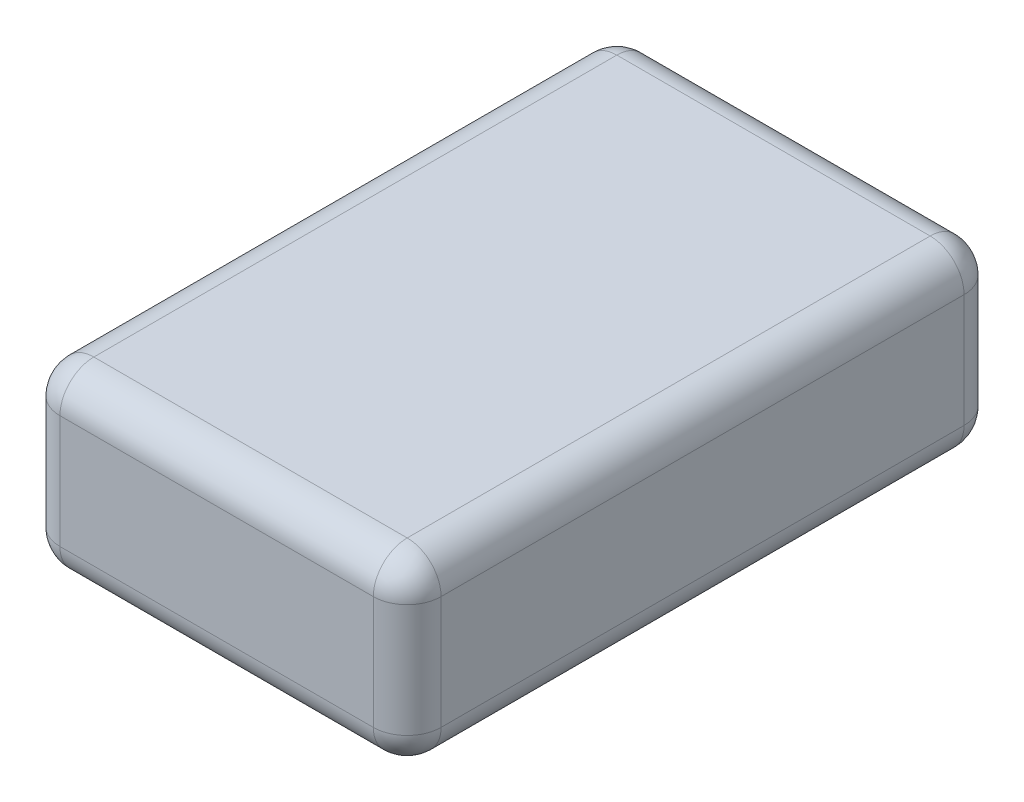
ISO-10303-21;
HEADER;
FILE_DESCRIPTION(('STEP AP214'),'2;1');
FILE_NAME('part.step','',(''),(''),'','','');
FILE_SCHEMA(('AUTOMOTIVE_DESIGN { 1 0 10303 214 1 1 1 1 }'));
ENDSEC;
DATA;
#1=APPLICATION_CONTEXT('core data for automotive mechanical design processes');
#2=APPLICATION_PROTOCOL_DEFINITION('international standard','automotive_design',2000,#1);
#3=PRODUCT_CONTEXT('',#1,'mechanical');
#4=PRODUCT('Part','Part','',(#3));
#5=PRODUCT_RELATED_PRODUCT_CATEGORY('part','',(#4));
#6=PRODUCT_DEFINITION_FORMATION('','',#4);
#7=PRODUCT_DEFINITION_CONTEXT('part definition',#1,'design');
#8=PRODUCT_DEFINITION('design','',#6,#7);
#9=PRODUCT_DEFINITION_SHAPE('','',#8);
#10=(LENGTH_UNIT() NAMED_UNIT(*) SI_UNIT(.MILLI.,.METRE.));
#11=(NAMED_UNIT(*) PLANE_ANGLE_UNIT() SI_UNIT($,.RADIAN.));
#12=(NAMED_UNIT(*) SI_UNIT($,.STERADIAN.) SOLID_ANGLE_UNIT());
#13=UNCERTAINTY_MEASURE_WITH_UNIT(LENGTH_MEASURE(1.E-05),#10,'distance_accuracy_value','');
#14=(GEOMETRIC_REPRESENTATION_CONTEXT(3) GLOBAL_UNCERTAINTY_ASSIGNED_CONTEXT((#13)) GLOBAL_UNIT_ASSIGNED_CONTEXT((#10,
#11,#12)) REPRESENTATION_CONTEXT('',''));
#15=CARTESIAN_POINT('',(0.,0.,0.));
#16=DIRECTION('',(0.,0.,1.));
#17=DIRECTION('',(1.,0.,0.));
#18=AXIS2_PLACEMENT_3D('',#15,#16,#17);
#19=CARTESIAN_POINT('',(10.,4.75,-15.499999988));
#20=DIRECTION('',(-1.,0.,0.));
#21=DIRECTION('',(0.,0.,1.));
#22=AXIS2_PLACEMENT_3D('',#19,#20,#21);
#23=PLANE('',#22);
#24=DIRECTION('',(0.,0.,-1.));
#25=VECTOR('',#24,1.);
#26=CARTESIAN_POINT('',(10.,2.972,15.499999988));
#27=LINE('',#26,#25);
#28=CARTESIAN_POINT('',(10.,2.972,-13.721999988));
#29=VERTEX_POINT('',#28);
#30=CARTESIAN_POINT('',(10.,2.972,13.721999988));
#31=VERTEX_POINT('',#30);
#32=EDGE_CURVE('E201',#29,#31,#27,.F.);
#33=ORIENTED_EDGE('',*,*,#32,.T.);
#34=DIRECTION('',(0.,-1.,0.));
#35=VECTOR('',#34,1.);
#36=CARTESIAN_POINT('',(10.,4.75,13.721999988));
#37=LINE('',#36,#35);
#38=CARTESIAN_POINT('',(10.,-2.972,13.721999988));
#39=VERTEX_POINT('',#38);
#40=EDGE_CURVE('E204',#31,#39,#37,.T.);
#41=ORIENTED_EDGE('',*,*,#40,.T.);
#42=DIRECTION('',(0.,0.,-1.));
#43=VECTOR('',#42,1.);
#44=CARTESIAN_POINT('',(10.,-2.972,-15.499999988));
#45=LINE('',#44,#43);
#46=CARTESIAN_POINT('',(10.,-2.972,-13.721999988));
#47=VERTEX_POINT('',#46);
#48=EDGE_CURVE('E195',#39,#47,#45,.T.);
#49=ORIENTED_EDGE('',*,*,#48,.T.);
#50=DIRECTION('',(0.,-1.,0.));
#51=VECTOR('',#50,1.);
#52=CARTESIAN_POINT('',(10.,4.75,-13.721999988));
#53=LINE('',#52,#51);
#54=EDGE_CURVE('E198',#47,#29,#53,.F.);
#55=ORIENTED_EDGE('',*,*,#54,.T.);
#56=EDGE_LOOP('',(#33,#41,#49,#55));
#57=FACE_BOUND('',#56,.T.);
#58=ADVANCED_FACE('F39',(#57),#23,.F.);
#59=CARTESIAN_POINT('',(-9.99999999999999,4.75,-15.499999988));
#60=DIRECTION('',(0.,0.,1.));
#61=DIRECTION('',(1.,0.,0.));
#62=AXIS2_PLACEMENT_3D('',#59,#60,#61);
#63=PLANE('',#62);
#64=DIRECTION('',(-1.,0.,0.));
#65=VECTOR('',#64,1.);
#66=CARTESIAN_POINT('',(10.,2.972,-15.499999988));
#67=LINE('',#66,#65);
#68=CARTESIAN_POINT('',(-8.22199999999999,2.972,-15.499999988));
#69=VERTEX_POINT('',#68);
#70=CARTESIAN_POINT('',(8.22200000000001,2.972,-15.499999988));
#71=VERTEX_POINT('',#70);
#72=EDGE_CURVE('E214',#69,#71,#67,.F.);
#73=ORIENTED_EDGE('',*,*,#72,.T.);
#74=DIRECTION('',(0.,-1.,0.));
#75=VECTOR('',#74,1.);
#76=CARTESIAN_POINT('',(8.22200000000001,4.75,-15.499999988));
#77=LINE('',#76,#75);
#78=CARTESIAN_POINT('',(8.22200000000001,-2.972,-15.499999988));
#79=VERTEX_POINT('',#78);
#80=EDGE_CURVE('E217',#71,#79,#77,.T.);
#81=ORIENTED_EDGE('',*,*,#80,.T.);
#82=DIRECTION('',(-1.,0.,0.));
#83=VECTOR('',#82,1.);
#84=CARTESIAN_POINT('',(-9.99999999999999,-2.972,-15.499999988));
#85=LINE('',#84,#83);
#86=CARTESIAN_POINT('',(-8.22199999999999,-2.972,-15.499999988));
#87=VERTEX_POINT('',#86);
#88=EDGE_CURVE('E208',#79,#87,#85,.T.);
#89=ORIENTED_EDGE('',*,*,#88,.T.);
#90=DIRECTION('',(0.,-1.,0.));
#91=VECTOR('',#90,1.);
#92=CARTESIAN_POINT('',(-8.22199999999999,4.75,-15.499999988));
#93=LINE('',#92,#91);
#94=EDGE_CURVE('E211',#87,#69,#93,.F.);
#95=ORIENTED_EDGE('',*,*,#94,.T.);
#96=EDGE_LOOP('',(#73,#81,#89,#95));
#97=FACE_BOUND('',#96,.T.);
#98=ADVANCED_FACE('F344',(#97),#63,.F.);
#99=CARTESIAN_POINT('',(-9.99999999999999,4.75,-15.499999988));
#100=DIRECTION('',(1.,0.,0.));
#101=DIRECTION('',(0.,0.,-1.));
#102=AXIS2_PLACEMENT_3D('',#99,#100,#101);
#103=PLANE('',#102);
#104=DIRECTION('',(0.,0.,1.));
#105=VECTOR('',#104,1.);
#106=CARTESIAN_POINT('',(-9.99999999999999,-2.972,-15.499999988));
#107=LINE('',#106,#105);
#108=CARTESIAN_POINT('',(-9.99999999999999,-2.972,-13.721999988));
#109=VERTEX_POINT('',#108);
#110=CARTESIAN_POINT('',(-9.99999999999999,-2.972,13.721999988));
#111=VERTEX_POINT('',#110);
#112=EDGE_CURVE('E166',#109,#111,#107,.T.);
#113=ORIENTED_EDGE('',*,*,#112,.T.);
#114=DIRECTION('',(0.,-1.,0.));
#115=VECTOR('',#114,1.);
#116=CARTESIAN_POINT('',(-9.99999999999999,4.75,13.721999988));
#117=LINE('',#116,#115);
#118=CARTESIAN_POINT('',(-9.99999999999999,2.972,13.721999988));
#119=VERTEX_POINT('',#118);
#120=EDGE_CURVE('E135',#111,#119,#117,.F.);
#121=ORIENTED_EDGE('',*,*,#120,.T.);
#122=DIRECTION('',(0.,0.,1.));
#123=VECTOR('',#122,1.);
#124=CARTESIAN_POINT('',(-9.99999999999999,2.972,-15.499999988));
#125=LINE('',#124,#123);
#126=CARTESIAN_POINT('',(-9.99999999999999,2.972,-13.721999988));
#127=VERTEX_POINT('',#126);
#128=EDGE_CURVE('E177',#119,#127,#125,.F.);
#129=ORIENTED_EDGE('',*,*,#128,.T.);
#130=DIRECTION('',(0.,-1.,0.));
#131=VECTOR('',#130,1.);
#132=CARTESIAN_POINT('',(-9.99999999999999,4.75,-13.721999988));
#133=LINE('',#132,#131);
#134=EDGE_CURVE('E170',#127,#109,#133,.T.);
#135=ORIENTED_EDGE('',*,*,#134,.T.);
#136=EDGE_LOOP('',(#113,#121,#129,#135));
#137=FACE_BOUND('',#136,.T.);
#138=ADVANCED_FACE('F360',(#137),#103,.F.);
#139=CARTESIAN_POINT('',(-9.99999999999999,4.75,15.499999988));
#140=DIRECTION('',(0.,0.,-1.));
#141=DIRECTION('',(-1.,0.,0.));
#142=AXIS2_PLACEMENT_3D('',#139,#140,#141);
#143=PLANE('',#142);
#144=DIRECTION('',(1.,0.,0.));
#145=VECTOR('',#144,1.);
#146=CARTESIAN_POINT('',(-9.99999999999999,2.972,15.499999988));
#147=LINE('',#146,#145);
#148=CARTESIAN_POINT('',(8.222,2.972,15.499999988));
#149=VERTEX_POINT('',#148);
#150=CARTESIAN_POINT('',(-8.22199999999999,2.972,15.499999988));
#151=VERTEX_POINT('',#150);
#152=EDGE_CURVE('E163',#149,#151,#147,.F.);
#153=ORIENTED_EDGE('',*,*,#152,.T.);
#154=DIRECTION('',(0.,-1.,0.));
#155=VECTOR('',#154,1.);
#156=CARTESIAN_POINT('',(-8.22199999999999,4.75,15.499999988));
#157=LINE('',#156,#155);
#158=CARTESIAN_POINT('',(-8.22199999999999,-2.972,15.499999988));
#159=VERTEX_POINT('',#158);
#160=EDGE_CURVE('E133',#151,#159,#157,.T.);
#161=ORIENTED_EDGE('',*,*,#160,.T.);
#162=DIRECTION('',(1.,0.,0.));
#163=VECTOR('',#162,1.);
#164=CARTESIAN_POINT('',(-9.99999999999999,-2.972,15.499999988));
#165=LINE('',#164,#163);
#166=CARTESIAN_POINT('',(8.222,-2.972,15.499999988));
#167=VERTEX_POINT('',#166);
#168=EDGE_CURVE('E152',#159,#167,#165,.T.);
#169=ORIENTED_EDGE('',*,*,#168,.T.);
#170=DIRECTION('',(0.,-1.,0.));
#171=VECTOR('',#170,1.);
#172=CARTESIAN_POINT('',(8.22200000000001,4.75,15.499999988));
#173=LINE('',#172,#171);
#174=EDGE_CURVE('E159',#167,#149,#173,.F.);
#175=ORIENTED_EDGE('',*,*,#174,.T.);
#176=EDGE_LOOP('',(#153,#161,#169,#175));
#177=FACE_BOUND('',#176,.T.);
#178=ADVANCED_FACE('F161',(#177),#143,.F.);
#179=CARTESIAN_POINT('',(0.,4.75,0.));
#180=DIRECTION('',(0.,1.,0.));
#181=DIRECTION('',(0.,0.,1.));
#182=AXIS2_PLACEMENT_3D('',#179,#180,#181);
#183=PLANE('',#182);
#184=DIRECTION('',(0.,0.,1.));
#185=VECTOR('',#184,1.);
#186=CARTESIAN_POINT('',(-8.22199999999999,4.75,15.499999988));
#187=LINE('',#186,#185);
#188=CARTESIAN_POINT('',(-8.22199999999999,4.75,-13.721999988));
#189=VERTEX_POINT('',#188);
#190=CARTESIAN_POINT('',(-8.22199999999999,4.75,13.721999988));
#191=VERTEX_POINT('',#190);
#192=EDGE_CURVE('E188',#189,#191,#187,.T.);
#193=ORIENTED_EDGE('',*,*,#192,.T.);
#194=DIRECTION('',(1.,0.,0.));
#195=VECTOR('',#194,1.);
#196=CARTESIAN_POINT('',(10.,4.75,13.721999988));
#197=LINE('',#196,#195);
#198=CARTESIAN_POINT('',(8.222,4.75,13.721999988));
#199=VERTEX_POINT('',#198);
#200=EDGE_CURVE('E191',#191,#199,#197,.T.);
#201=ORIENTED_EDGE('',*,*,#200,.T.);
#202=DIRECTION('',(0.,0.,-1.));
#203=VECTOR('',#202,1.);
#204=CARTESIAN_POINT('',(8.222,4.75,-15.499999988));
#205=LINE('',#204,#203);
#206=CARTESIAN_POINT('',(8.222,4.75,-13.721999988));
#207=VERTEX_POINT('',#206);
#208=EDGE_CURVE('E185',#199,#207,#205,.T.);
#209=ORIENTED_EDGE('',*,*,#208,.T.);
#210=DIRECTION('',(-1.,0.,0.));
#211=VECTOR('',#210,1.);
#212=CARTESIAN_POINT('',(-9.99999999999999,4.75,-13.721999988));
#213=LINE('',#212,#211);
#214=EDGE_CURVE('E182',#207,#189,#213,.T.);
#215=ORIENTED_EDGE('',*,*,#214,.T.);
#216=EDGE_LOOP('',(#193,#201,#209,#215));
#217=FACE_BOUND('',#216,.T.);
#218=ADVANCED_FACE('F324',(#217),#183,.T.);
#219=CARTESIAN_POINT('',(0.,-4.75,0.));
#220=DIRECTION('',(0.,1.,0.));
#221=DIRECTION('',(0.,0.,1.));
#222=AXIS2_PLACEMENT_3D('',#219,#220,#221);
#223=PLANE('',#222);
#224=DIRECTION('',(0.,0.,1.));
#225=VECTOR('',#224,1.);
#226=CARTESIAN_POINT('',(-8.22199999999999,-4.75,0.));
#227=LINE('',#226,#225);
#228=CARTESIAN_POINT('',(-8.22199999999999,-4.75,13.721999988));
#229=VERTEX_POINT('',#228);
#230=CARTESIAN_POINT('',(-8.22199999999999,-4.75,-13.721999988));
#231=VERTEX_POINT('',#230);
#232=EDGE_CURVE('E49',#229,#231,#227,.F.);
#233=ORIENTED_EDGE('',*,*,#232,.T.);
#234=DIRECTION('',(-1.,0.,0.));
#235=VECTOR('',#234,1.);
#236=CARTESIAN_POINT('',(0.,-4.75,-13.721999988));
#237=LINE('',#236,#235);
#238=CARTESIAN_POINT('',(8.222,-4.75,-13.721999988));
#239=VERTEX_POINT('',#238);
#240=EDGE_CURVE('E11',#231,#239,#237,.F.);
#241=ORIENTED_EDGE('',*,*,#240,.T.);
#242=DIRECTION('',(0.,0.,-1.));
#243=VECTOR('',#242,1.);
#244=CARTESIAN_POINT('',(8.222,-4.75,0.));
#245=LINE('',#244,#243);
#246=CARTESIAN_POINT('',(8.222,-4.75,13.721999988));
#247=VERTEX_POINT('',#246);
#248=EDGE_CURVE('E221',#239,#247,#245,.F.);
#249=ORIENTED_EDGE('',*,*,#248,.T.);
#250=DIRECTION('',(1.,0.,0.));
#251=VECTOR('',#250,1.);
#252=CARTESIAN_POINT('',(0.,-4.75,13.721999988));
#253=LINE('',#252,#251);
#254=EDGE_CURVE('E60',#247,#229,#253,.F.);
#255=ORIENTED_EDGE('',*,*,#254,.T.);
#256=EDGE_LOOP('',(#233,#241,#249,#255));
#257=FACE_BOUND('',#256,.T.);
#258=ADVANCED_FACE('F531',(#257),#223,.F.);
#259=CARTESIAN_POINT('',(8.22200000000001,4.75,-13.721999988));
#260=DIRECTION('',(0.,-1.,0.));
#261=DIRECTION('',(0.,0.,-1.));
#262=AXIS2_PLACEMENT_3D('',#259,#260,#261);
#263=CYLINDRICAL_SURFACE('',#262,1.778);
#264=CARTESIAN_POINT('',(8.222,2.972,-13.721999988));
#265=DIRECTION('',(0.,1.,0.));
#266=DIRECTION('',(0.,0.,1.));
#267=AXIS2_PLACEMENT_3D('',#264,#265,#266);
#268=CIRCLE('',#267,1.778);
#269=EDGE_CURVE('E43',#29,#71,#268,.T.);
#270=ORIENTED_EDGE('',*,*,#269,.F.);
#271=ORIENTED_EDGE('',*,*,#54,.F.);
#272=CARTESIAN_POINT('',(8.22200000000001,-2.972,-13.721999988));
#273=DIRECTION('',(0.,-1.,0.));
#274=DIRECTION('',(0.,0.,-1.));
#275=AXIS2_PLACEMENT_3D('',#272,#273,#274);
#276=CIRCLE('',#275,1.778);
#277=EDGE_CURVE('E298',#79,#47,#276,.T.);
#278=ORIENTED_EDGE('',*,*,#277,.F.);
#279=ORIENTED_EDGE('',*,*,#80,.F.);
#280=EDGE_LOOP('',(#270,#271,#278,#279));
#281=FACE_BOUND('',#280,.T.);
#282=ADVANCED_FACE('F41',(#281),#263,.T.);
#283=CARTESIAN_POINT('',(8.222,2.972,-13.721999988));
#284=DIRECTION('',(0.,0.,1.));
#285=DIRECTION('',(1.,0.,0.));
#286=AXIS2_PLACEMENT_3D('',#283,#284,#285);
#287=SPHERICAL_SURFACE('',#286,1.778);
#288=CARTESIAN_POINT('',(8.222,2.972,-13.721999988));
#289=DIRECTION('',(0.,0.,-1.));
#290=DIRECTION('',(-1.,0.,0.));
#291=AXIS2_PLACEMENT_3D('',#288,#289,#290);
#292=CIRCLE('',#291,1.778);
#293=EDGE_CURVE('E291',#29,#207,#292,.F.);
#294=ORIENTED_EDGE('',*,*,#293,.F.);
#295=ORIENTED_EDGE('',*,*,#269,.T.);
#296=CARTESIAN_POINT('',(8.22200000000001,2.972,-13.721999988));
#297=DIRECTION('',(1.,0.,0.));
#298=DIRECTION('',(0.,1.,0.));
#299=AXIS2_PLACEMENT_3D('',#296,#297,#298);
#300=CIRCLE('',#299,1.778);
#301=EDGE_CURVE('E295',#207,#71,#300,.F.);
#302=ORIENTED_EDGE('',*,*,#301,.F.);
#303=EDGE_LOOP('',(#294,#295,#302));
#304=FACE_BOUND('',#303,.T.);
#305=ADVANCED_FACE('F311',(#304),#287,.T.);
#306=CARTESIAN_POINT('',(8.222,-2.972,-13.721999988));
#307=DIRECTION('',(0.,0.,1.));
#308=DIRECTION('',(1.,0.,0.));
#309=AXIS2_PLACEMENT_3D('',#306,#307,#308);
#310=SPHERICAL_SURFACE('',#309,1.778);
#311=CARTESIAN_POINT('',(8.222,-2.972,-13.721999988));
#312=DIRECTION('',(1.,0.,0.));
#313=DIRECTION('',(0.,0.,-1.));
#314=AXIS2_PLACEMENT_3D('',#311,#312,#313);
#315=CIRCLE('',#314,1.778);
#316=EDGE_CURVE('E283',#79,#239,#315,.F.);
#317=ORIENTED_EDGE('',*,*,#316,.F.);
#318=ORIENTED_EDGE('',*,*,#277,.T.);
#319=CARTESIAN_POINT('',(8.222,-2.972,-13.721999988));
#320=DIRECTION('',(0.,0.,-1.));
#321=DIRECTION('',(-1.,0.,0.));
#322=AXIS2_PLACEMENT_3D('',#319,#320,#321);
#323=CIRCLE('',#322,1.778);
#324=EDGE_CURVE('E287',#239,#47,#323,.F.);
#325=ORIENTED_EDGE('',*,*,#324,.F.);
#326=EDGE_LOOP('',(#317,#318,#325));
#327=FACE_BOUND('',#326,.T.);
#328=ADVANCED_FACE('F510',(#327),#310,.T.);
#329=CARTESIAN_POINT('',(0.,2.972,-13.721999988));
#330=DIRECTION('',(1.,0.,0.));
#331=DIRECTION('',(0.,0.,-1.));
#332=AXIS2_PLACEMENT_3D('',#329,#330,#331);
#333=CYLINDRICAL_SURFACE('',#332,1.778);
#334=ORIENTED_EDGE('',*,*,#301,.T.);
#335=ORIENTED_EDGE('',*,*,#72,.F.);
#336=CARTESIAN_POINT('',(-8.22199999999999,2.972,-13.721999988));
#337=DIRECTION('',(-1.,0.,0.));
#338=DIRECTION('',(0.,0.,1.));
#339=AXIS2_PLACEMENT_3D('',#336,#337,#338);
#340=CIRCLE('',#339,1.778);
#341=EDGE_CURVE('E275',#189,#69,#340,.T.);
#342=ORIENTED_EDGE('',*,*,#341,.F.);
#343=ORIENTED_EDGE('',*,*,#214,.F.);
#344=EDGE_LOOP('',(#334,#335,#342,#343));
#345=FACE_BOUND('',#344,.T.);
#346=ADVANCED_FACE('F319',(#345),#333,.T.);
#347=CARTESIAN_POINT('',(8.222,2.972,0.));
#348=DIRECTION('',(0.,0.,1.));
#349=DIRECTION('',(1.,0.,0.));
#350=AXIS2_PLACEMENT_3D('',#347,#348,#349);
#351=CYLINDRICAL_SURFACE('',#350,1.778);
#352=ORIENTED_EDGE('',*,*,#293,.T.);
#353=ORIENTED_EDGE('',*,*,#208,.F.);
#354=CARTESIAN_POINT('',(8.222,2.972,13.721999988));
#355=DIRECTION('',(0.,0.,1.));
#356=DIRECTION('',(0.,-1.,0.));
#357=AXIS2_PLACEMENT_3D('',#354,#355,#356);
#358=CIRCLE('',#357,1.778);
#359=EDGE_CURVE('E271',#31,#199,#358,.T.);
#360=ORIENTED_EDGE('',*,*,#359,.F.);
#361=ORIENTED_EDGE('',*,*,#32,.F.);
#362=EDGE_LOOP('',(#352,#353,#360,#361));
#363=FACE_BOUND('',#362,.T.);
#364=ADVANCED_FACE('F330',(#363),#351,.T.);
#365=CARTESIAN_POINT('',(8.222,4.75,13.721999988));
#366=DIRECTION('',(0.,-1.,0.));
#367=DIRECTION('',(0.,0.,-1.));
#368=AXIS2_PLACEMENT_3D('',#365,#366,#367);
#369=CYLINDRICAL_SURFACE('',#368,1.778);
#370=CARTESIAN_POINT('',(8.222,-2.972,13.721999988));
#371=DIRECTION('',(0.,-1.,0.));
#372=DIRECTION('',(0.,0.,-1.));
#373=AXIS2_PLACEMENT_3D('',#370,#371,#372);
#374=CIRCLE('',#373,1.778);
#375=EDGE_CURVE('E263',#39,#167,#374,.T.);
#376=ORIENTED_EDGE('',*,*,#375,.F.);
#377=ORIENTED_EDGE('',*,*,#40,.F.);
#378=CARTESIAN_POINT('',(8.222,2.972,13.721999988));
#379=DIRECTION('',(0.,1.,0.));
#380=DIRECTION('',(0.,0.,1.));
#381=AXIS2_PLACEMENT_3D('',#378,#379,#380);
#382=CIRCLE('',#381,1.778);
#383=EDGE_CURVE('E267',#149,#31,#382,.T.);
#384=ORIENTED_EDGE('',*,*,#383,.F.);
#385=ORIENTED_EDGE('',*,*,#174,.F.);
#386=EDGE_LOOP('',(#376,#377,#384,#385));
#387=FACE_BOUND('',#386,.T.);
#388=ADVANCED_FACE('F336',(#387),#369,.T.);
#389=CARTESIAN_POINT('',(8.222,-2.972,-15.499999988));
#390=DIRECTION('',(0.,0.,-1.));
#391=DIRECTION('',(-1.,0.,0.));
#392=AXIS2_PLACEMENT_3D('',#389,#390,#391);
#393=CYLINDRICAL_SURFACE('',#392,1.778);
#394=ORIENTED_EDGE('',*,*,#324,.T.);
#395=ORIENTED_EDGE('',*,*,#48,.F.);
#396=CARTESIAN_POINT('',(8.222,-2.972,13.721999988));
#397=DIRECTION('',(0.,0.,1.));
#398=DIRECTION('',(1.,0.,0.));
#399=AXIS2_PLACEMENT_3D('',#396,#397,#398);
#400=CIRCLE('',#399,1.778);
#401=EDGE_CURVE('E260',#247,#39,#400,.T.);
#402=ORIENTED_EDGE('',*,*,#401,.F.);
#403=ORIENTED_EDGE('',*,*,#248,.F.);
#404=EDGE_LOOP('',(#394,#395,#402,#403));
#405=FACE_BOUND('',#404,.T.);
#406=ADVANCED_FACE('F342',(#405),#393,.T.);
#407=CARTESIAN_POINT('',(-9.99999999999999,-2.972,-13.721999988));
#408=DIRECTION('',(-1.,0.,0.));
#409=DIRECTION('',(0.,0.,1.));
#410=AXIS2_PLACEMENT_3D('',#407,#408,#409);
#411=CYLINDRICAL_SURFACE('',#410,1.778);
#412=ORIENTED_EDGE('',*,*,#316,.T.);
#413=ORIENTED_EDGE('',*,*,#240,.F.);
#414=CARTESIAN_POINT('',(-8.22199999999999,-2.972,-13.721999988));
#415=DIRECTION('',(-1.,0.,0.));
#416=DIRECTION('',(0.,0.,1.));
#417=AXIS2_PLACEMENT_3D('',#414,#415,#416);
#418=CIRCLE('',#417,1.778);
#419=EDGE_CURVE('E256',#87,#231,#418,.T.);
#420=ORIENTED_EDGE('',*,*,#419,.F.);
#421=ORIENTED_EDGE('',*,*,#88,.F.);
#422=EDGE_LOOP('',(#412,#413,#420,#421));
#423=FACE_BOUND('',#422,.T.);
#424=ADVANCED_FACE('F353',(#423),#411,.T.);
#425=CARTESIAN_POINT('',(-8.22199999999999,4.75,-13.721999988));
#426=DIRECTION('',(0.,-1.,0.));
#427=DIRECTION('',(0.,0.,-1.));
#428=AXIS2_PLACEMENT_3D('',#425,#426,#427);
#429=CYLINDRICAL_SURFACE('',#428,1.778);
#430=CARTESIAN_POINT('',(-8.22199999999999,2.972,-13.721999988));
#431=DIRECTION('',(0.,1.,0.));
#432=DIRECTION('',(0.,0.,1.));
#433=AXIS2_PLACEMENT_3D('',#430,#431,#432);
#434=CIRCLE('',#433,1.778);
#435=EDGE_CURVE('E279',#69,#127,#434,.T.);
#436=ORIENTED_EDGE('',*,*,#435,.F.);
#437=ORIENTED_EDGE('',*,*,#94,.F.);
#438=CARTESIAN_POINT('',(-8.22199999999999,-2.972,-13.721999988));
#439=DIRECTION('',(0.,-1.,0.));
#440=DIRECTION('',(0.,0.,-1.));
#441=AXIS2_PLACEMENT_3D('',#438,#439,#440);
#442=CIRCLE('',#441,1.778);
#443=EDGE_CURVE('E252',#109,#87,#442,.T.);
#444=ORIENTED_EDGE('',*,*,#443,.F.);
#445=ORIENTED_EDGE('',*,*,#134,.F.);
#446=EDGE_LOOP('',(#436,#437,#444,#445));
#447=FACE_BOUND('',#446,.T.);
#448=ADVANCED_FACE('F349',(#447),#429,.T.);
#449=CARTESIAN_POINT('',(-8.22199999999999,2.972,-13.721999988));
#450=DIRECTION('',(0.,0.,1.));
#451=DIRECTION('',(1.,0.,0.));
#452=AXIS2_PLACEMENT_3D('',#449,#450,#451);
#453=SPHERICAL_SURFACE('',#452,1.778);
#454=ORIENTED_EDGE('',*,*,#341,.T.);
#455=ORIENTED_EDGE('',*,*,#435,.T.);
#456=CARTESIAN_POINT('',(-8.22199999999999,2.972,-13.721999988));
#457=DIRECTION('',(0.,0.,-1.));
#458=DIRECTION('',(-1.,0.,0.));
#459=AXIS2_PLACEMENT_3D('',#456,#457,#458);
#460=CIRCLE('',#459,1.778);
#461=EDGE_CURVE('E248',#189,#127,#460,.F.);
#462=ORIENTED_EDGE('',*,*,#461,.F.);
#463=EDGE_LOOP('',(#454,#455,#462));
#464=FACE_BOUND('',#463,.T.);
#465=ADVANCED_FACE('F363',(#464),#453,.T.);
#466=CARTESIAN_POINT('',(8.222,2.972,13.721999988));
#467=DIRECTION('',(0.,0.,1.));
#468=DIRECTION('',(1.,0.,0.));
#469=AXIS2_PLACEMENT_3D('',#466,#467,#468);
#470=SPHERICAL_SURFACE('',#469,1.778);
#471=ORIENTED_EDGE('',*,*,#383,.T.);
#472=ORIENTED_EDGE('',*,*,#359,.T.);
#473=CARTESIAN_POINT('',(8.222,2.972,13.721999988));
#474=DIRECTION('',(1.,0.,0.));
#475=DIRECTION('',(0.,0.,-1.));
#476=AXIS2_PLACEMENT_3D('',#473,#474,#475);
#477=CIRCLE('',#476,1.778);
#478=EDGE_CURVE('E245',#149,#199,#477,.F.);
#479=ORIENTED_EDGE('',*,*,#478,.F.);
#480=EDGE_LOOP('',(#471,#472,#479));
#481=FACE_BOUND('',#480,.T.);
#482=ADVANCED_FACE('F373',(#481),#470,.T.);
#483=CARTESIAN_POINT('',(8.222,-2.972,13.721999988));
#484=DIRECTION('',(0.,0.,1.));
#485=DIRECTION('',(1.,0.,0.));
#486=AXIS2_PLACEMENT_3D('',#483,#484,#485);
#487=SPHERICAL_SURFACE('',#486,1.778);
#488=ORIENTED_EDGE('',*,*,#401,.T.);
#489=ORIENTED_EDGE('',*,*,#375,.T.);
#490=CARTESIAN_POINT('',(8.222,-2.972,13.721999988));
#491=DIRECTION('',(1.,0.,0.));
#492=DIRECTION('',(0.,0.,-1.));
#493=AXIS2_PLACEMENT_3D('',#490,#491,#492);
#494=CIRCLE('',#493,1.778);
#495=EDGE_CURVE('E155',#247,#167,#494,.F.);
#496=ORIENTED_EDGE('',*,*,#495,.F.);
#497=EDGE_LOOP('',(#488,#489,#496));
#498=FACE_BOUND('',#497,.T.);
#499=ADVANCED_FACE('F375',(#498),#487,.T.);
#500=CARTESIAN_POINT('',(-8.22199999999999,-2.972,-13.721999988));
#501=DIRECTION('',(0.,0.,1.));
#502=DIRECTION('',(1.,0.,0.));
#503=AXIS2_PLACEMENT_3D('',#500,#501,#502);
#504=SPHERICAL_SURFACE('',#503,1.778);
#505=ORIENTED_EDGE('',*,*,#443,.T.);
#506=ORIENTED_EDGE('',*,*,#419,.T.);
#507=CARTESIAN_POINT('',(-8.22199999999999,-2.972,-13.721999988));
#508=DIRECTION('',(0.,0.,-1.));
#509=DIRECTION('',(-1.,0.,0.));
#510=AXIS2_PLACEMENT_3D('',#507,#508,#509);
#511=CIRCLE('',#510,1.778);
#512=EDGE_CURVE('E239',#109,#231,#511,.F.);
#513=ORIENTED_EDGE('',*,*,#512,.F.);
#514=EDGE_LOOP('',(#505,#506,#513));
#515=FACE_BOUND('',#514,.T.);
#516=ADVANCED_FACE('F355',(#515),#504,.T.);
#517=CARTESIAN_POINT('',(-8.22199999999999,2.972,0.));
#518=DIRECTION('',(0.,0.,-1.));
#519=DIRECTION('',(-1.,0.,0.));
#520=AXIS2_PLACEMENT_3D('',#517,#518,#519);
#521=CYLINDRICAL_SURFACE('',#520,1.778);
#522=ORIENTED_EDGE('',*,*,#461,.T.);
#523=ORIENTED_EDGE('',*,*,#128,.F.);
#524=CARTESIAN_POINT('',(-8.22199999999999,2.972,13.721999988));
#525=DIRECTION('',(0.,0.,1.));
#526=DIRECTION('',(1.,0.,0.));
#527=AXIS2_PLACEMENT_3D('',#524,#525,#526);
#528=CIRCLE('',#527,1.778);
#529=EDGE_CURVE('E235',#191,#119,#528,.T.);
#530=ORIENTED_EDGE('',*,*,#529,.F.);
#531=ORIENTED_EDGE('',*,*,#192,.F.);
#532=EDGE_LOOP('',(#522,#523,#530,#531));
#533=FACE_BOUND('',#532,.T.);
#534=ADVANCED_FACE('F365',(#533),#521,.T.);
#535=CARTESIAN_POINT('',(0.,2.972,13.721999988));
#536=DIRECTION('',(-1.,0.,0.));
#537=DIRECTION('',(0.,0.,1.));
#538=AXIS2_PLACEMENT_3D('',#535,#536,#537);
#539=CYLINDRICAL_SURFACE('',#538,1.778);
#540=ORIENTED_EDGE('',*,*,#478,.T.);
#541=ORIENTED_EDGE('',*,*,#200,.F.);
#542=CARTESIAN_POINT('',(-8.22199999999999,2.972,13.721999988));
#543=DIRECTION('',(-1.,0.,0.));
#544=DIRECTION('',(0.,0.,1.));
#545=AXIS2_PLACEMENT_3D('',#542,#543,#544);
#546=CIRCLE('',#545,1.778);
#547=EDGE_CURVE('E149',#151,#191,#546,.T.);
#548=ORIENTED_EDGE('',*,*,#547,.F.);
#549=ORIENTED_EDGE('',*,*,#152,.F.);
#550=EDGE_LOOP('',(#540,#541,#548,#549));
#551=FACE_BOUND('',#550,.T.);
#552=ADVANCED_FACE('F371',(#551),#539,.T.);
#553=CARTESIAN_POINT('',(-9.99999999999999,-2.972,13.721999988));
#554=DIRECTION('',(1.,0.,0.));
#555=DIRECTION('',(0.,0.,-1.));
#556=AXIS2_PLACEMENT_3D('',#553,#554,#555);
#557=CYLINDRICAL_SURFACE('',#556,1.778);
#558=ORIENTED_EDGE('',*,*,#495,.T.);
#559=ORIENTED_EDGE('',*,*,#168,.F.);
#560=CARTESIAN_POINT('',(-8.22199999999999,-2.972,13.721999988));
#561=DIRECTION('',(-1.,0.,0.));
#562=DIRECTION('',(0.,0.,1.));
#563=AXIS2_PLACEMENT_3D('',#560,#561,#562);
#564=CIRCLE('',#563,1.778);
#565=EDGE_CURVE('E142',#229,#159,#564,.T.);
#566=ORIENTED_EDGE('',*,*,#565,.F.);
#567=ORIENTED_EDGE('',*,*,#254,.F.);
#568=EDGE_LOOP('',(#558,#559,#566,#567));
#569=FACE_BOUND('',#568,.T.);
#570=ADVANCED_FACE('F153',(#569),#557,.T.);
#571=CARTESIAN_POINT('',(-8.22199999999999,-2.972,-15.499999988));
#572=DIRECTION('',(0.,0.,1.));
#573=DIRECTION('',(1.,0.,0.));
#574=AXIS2_PLACEMENT_3D('',#571,#572,#573);
#575=CYLINDRICAL_SURFACE('',#574,1.778);
#576=ORIENTED_EDGE('',*,*,#512,.T.);
#577=ORIENTED_EDGE('',*,*,#232,.F.);
#578=CARTESIAN_POINT('',(-8.22199999999999,-2.972,13.721999988));
#579=DIRECTION('',(0.,0.,1.));
#580=DIRECTION('',(1.,0.,0.));
#581=AXIS2_PLACEMENT_3D('',#578,#579,#580);
#582=CIRCLE('',#581,1.778);
#583=EDGE_CURVE('E146',#111,#229,#582,.T.);
#584=ORIENTED_EDGE('',*,*,#583,.F.);
#585=ORIENTED_EDGE('',*,*,#112,.F.);
#586=EDGE_LOOP('',(#576,#577,#584,#585));
#587=FACE_BOUND('',#586,.T.);
#588=ADVANCED_FACE('F358',(#587),#575,.T.);
#589=CARTESIAN_POINT('',(-8.22199999999999,2.972,13.721999988));
#590=DIRECTION('',(0.,0.,1.));
#591=DIRECTION('',(1.,0.,0.));
#592=AXIS2_PLACEMENT_3D('',#589,#590,#591);
#593=SPHERICAL_SURFACE('',#592,1.778);
#594=ORIENTED_EDGE('',*,*,#547,.T.);
#595=ORIENTED_EDGE('',*,*,#529,.T.);
#596=CARTESIAN_POINT('',(-8.22199999999999,2.972,13.721999988));
#597=DIRECTION('',(0.,1.,0.));
#598=DIRECTION('',(0.,0.,1.));
#599=AXIS2_PLACEMENT_3D('',#596,#597,#598);
#600=CIRCLE('',#599,1.778);
#601=EDGE_CURVE('E139',#151,#119,#600,.F.);
#602=ORIENTED_EDGE('',*,*,#601,.F.);
#603=EDGE_LOOP('',(#594,#595,#602));
#604=FACE_BOUND('',#603,.T.);
#605=ADVANCED_FACE('F369',(#604),#593,.T.);
#606=CARTESIAN_POINT('',(-8.22199999999999,-2.972,13.721999988));
#607=DIRECTION('',(0.,0.,1.));
#608=DIRECTION('',(1.,0.,0.));
#609=AXIS2_PLACEMENT_3D('',#606,#607,#608);
#610=SPHERICAL_SURFACE('',#609,1.778);
#611=ORIENTED_EDGE('',*,*,#583,.T.);
#612=ORIENTED_EDGE('',*,*,#565,.T.);
#613=CARTESIAN_POINT('',(-8.22199999999999,-2.972,13.721999988));
#614=DIRECTION('',(0.,-1.,0.));
#615=DIRECTION('',(0.,0.,-1.));
#616=AXIS2_PLACEMENT_3D('',#613,#614,#615);
#617=CIRCLE('',#616,1.778);
#618=EDGE_CURVE('E129',#111,#159,#617,.F.);
#619=ORIENTED_EDGE('',*,*,#618,.F.);
#620=EDGE_LOOP('',(#611,#612,#619));
#621=FACE_BOUND('',#620,.T.);
#622=ADVANCED_FACE('F144',(#621),#610,.T.);
#623=CARTESIAN_POINT('',(-8.22199999999999,4.75,13.721999988));
#624=DIRECTION('',(0.,-1.,0.));
#625=DIRECTION('',(0.,0.,-1.));
#626=AXIS2_PLACEMENT_3D('',#623,#624,#625);
#627=CYLINDRICAL_SURFACE('',#626,1.778);
#628=ORIENTED_EDGE('',*,*,#601,.T.);
#629=ORIENTED_EDGE('',*,*,#120,.F.);
#630=ORIENTED_EDGE('',*,*,#618,.T.);
#631=ORIENTED_EDGE('',*,*,#160,.F.);
#632=EDGE_LOOP('',(#628,#629,#630,#631));
#633=FACE_BOUND('',#632,.T.);
#634=ADVANCED_FACE('F131',(#633),#627,.T.);
#635=CLOSED_SHELL('',(#58,#98,#138,#178,#218,#258,#282,#305,#328,#346,#364,#388,#406,#424,#448,
#465,#482,#499,#516,#534,#552,#570,#588,#605,#622,#634));
#636=MANIFOLD_SOLID_BREP('B2',#635);
#637=ADVANCED_BREP_SHAPE_REPRESENTATION('',(#18,#636),#14);
#638=SHAPE_DEFINITION_REPRESENTATION(#9,#637);
ENDSEC;
END-ISO-10303-21;
